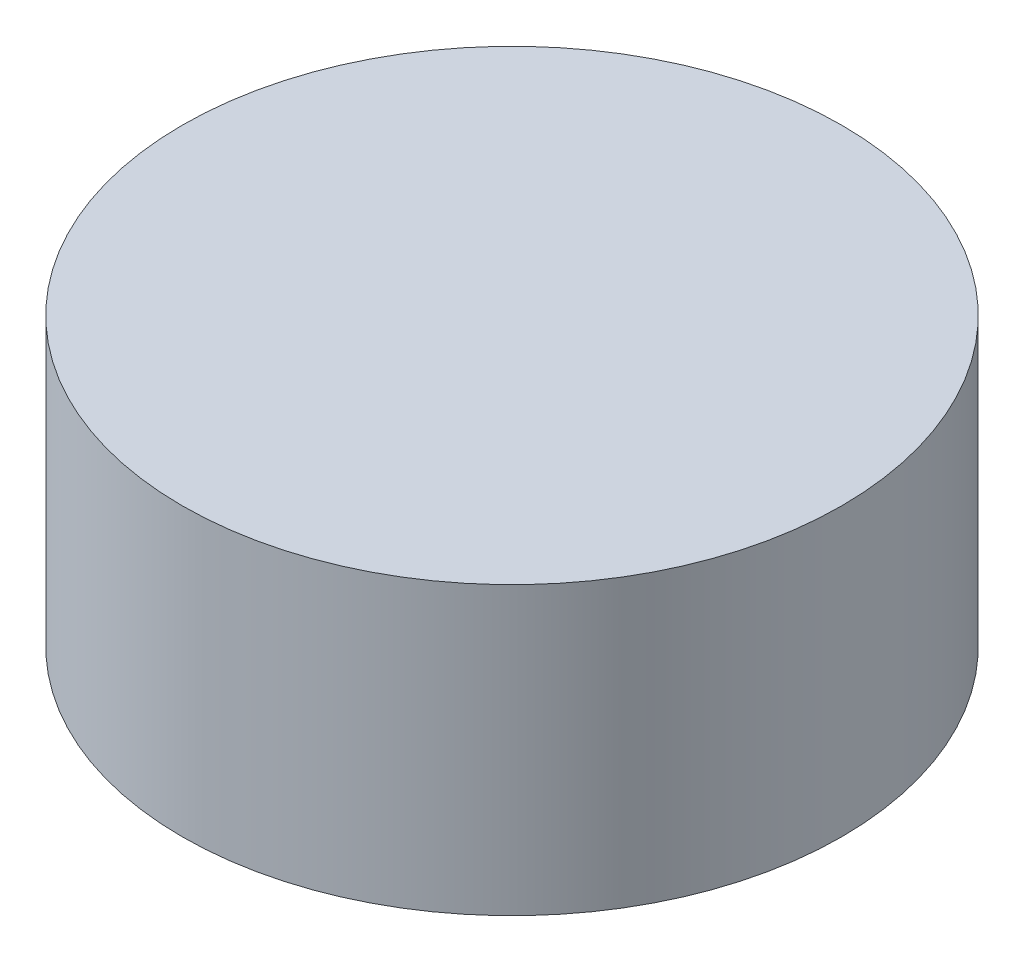
ISO-10303-21;
HEADER;
FILE_DESCRIPTION(('STEP AP214'),'2;1');
FILE_NAME('part.step','',(''),(''),'','','');
FILE_SCHEMA(('AUTOMOTIVE_DESIGN { 1 0 10303 214 1 1 1 1 }'));
ENDSEC;
DATA;
#1=APPLICATION_CONTEXT('core data for automotive mechanical design processes');
#2=APPLICATION_PROTOCOL_DEFINITION('international standard','automotive_design',2000,#1);
#3=PRODUCT_CONTEXT('',#1,'mechanical');
#4=PRODUCT('Part','Part','',(#3));
#5=PRODUCT_RELATED_PRODUCT_CATEGORY('part','',(#4));
#6=PRODUCT_DEFINITION_FORMATION('','',#4);
#7=PRODUCT_DEFINITION_CONTEXT('part definition',#1,'design');
#8=PRODUCT_DEFINITION('design','',#6,#7);
#9=PRODUCT_DEFINITION_SHAPE('','',#8);
#10=(LENGTH_UNIT() NAMED_UNIT(*) SI_UNIT(.MILLI.,.METRE.));
#11=(NAMED_UNIT(*) PLANE_ANGLE_UNIT() SI_UNIT($,.RADIAN.));
#12=(NAMED_UNIT(*) SI_UNIT($,.STERADIAN.) SOLID_ANGLE_UNIT());
#13=UNCERTAINTY_MEASURE_WITH_UNIT(LENGTH_MEASURE(1.E-05),#10,'distance_accuracy_value','');
#14=(GEOMETRIC_REPRESENTATION_CONTEXT(3) GLOBAL_UNCERTAINTY_ASSIGNED_CONTEXT((#13)) GLOBAL_UNIT_ASSIGNED_CONTEXT((#10,
#11,#12)) REPRESENTATION_CONTEXT('',''));
#15=CARTESIAN_POINT('',(0.,0.,0.));
#16=DIRECTION('',(0.,0.,1.));
#17=DIRECTION('',(1.,0.,0.));
#18=AXIS2_PLACEMENT_3D('',#15,#16,#17);
#19=CARTESIAN_POINT('',(0.,40.,0.));
#20=DIRECTION('',(0.,-1.,0.));
#21=DIRECTION('',(0.,0.,-1.));
#22=AXIS2_PLACEMENT_3D('',#19,#20,#21);
#23=CYLINDRICAL_SURFACE('',#22,46.);
#24=CARTESIAN_POINT('',(0.,40.,0.));
#25=DIRECTION('',(0.,1.,0.));
#26=DIRECTION('',(0.,0.,1.));
#27=AXIS2_PLACEMENT_3D('',#24,#25,#26);
#28=CIRCLE('',#27,46.);
#29=CARTESIAN_POINT('',(0.,40.,46.));
#30=VERTEX_POINT('',#29);
#31=EDGE_CURVE('E10',#30,#30,#28,.T.);
#32=ORIENTED_EDGE('',*,*,#31,.F.);
#33=EDGE_LOOP('',(#32));
#34=FACE_BOUND('',#33,.T.);
#35=CARTESIAN_POINT('',(0.,0.,0.));
#36=DIRECTION('',(0.,1.,0.));
#37=DIRECTION('',(0.,0.,1.));
#38=AXIS2_PLACEMENT_3D('',#35,#36,#37);
#39=CIRCLE('',#38,46.);
#40=CARTESIAN_POINT('',(0.,0.,46.));
#41=VERTEX_POINT('',#40);
#42=EDGE_CURVE('E36',#41,#41,#39,.T.);
#43=ORIENTED_EDGE('',*,*,#42,.T.);
#44=EDGE_LOOP('',(#43));
#45=FACE_BOUND('',#44,.T.);
#46=ADVANCED_FACE('F33',(#34,#45),#23,.T.);
#47=CARTESIAN_POINT('',(0.,40.,0.));
#48=DIRECTION('',(0.,1.,0.));
#49=DIRECTION('',(0.,0.,1.));
#50=AXIS2_PLACEMENT_3D('',#47,#48,#49);
#51=PLANE('',#50);
#52=ORIENTED_EDGE('',*,*,#31,.T.);
#53=EDGE_LOOP('',(#52));
#54=FACE_BOUND('',#53,.T.);
#55=ADVANCED_FACE('F48',(#54),#51,.T.);
#56=CARTESIAN_POINT('',(0.,0.,0.));
#57=DIRECTION('',(0.,1.,0.));
#58=DIRECTION('',(0.,0.,1.));
#59=AXIS2_PLACEMENT_3D('',#56,#57,#58);
#60=PLANE('',#59);
#61=ORIENTED_EDGE('',*,*,#42,.F.);
#62=EDGE_LOOP('',(#61));
#63=FACE_BOUND('',#62,.T.);
#64=ADVANCED_FACE('F46',(#63),#60,.F.);
#65=CLOSED_SHELL('',(#46,#55,#64));
#66=MANIFOLD_SOLID_BREP('B2',#65);
#67=ADVANCED_BREP_SHAPE_REPRESENTATION('',(#18,#66),#14);
#68=SHAPE_DEFINITION_REPRESENTATION(#9,#67);
ENDSEC;
END-ISO-10303-21;
